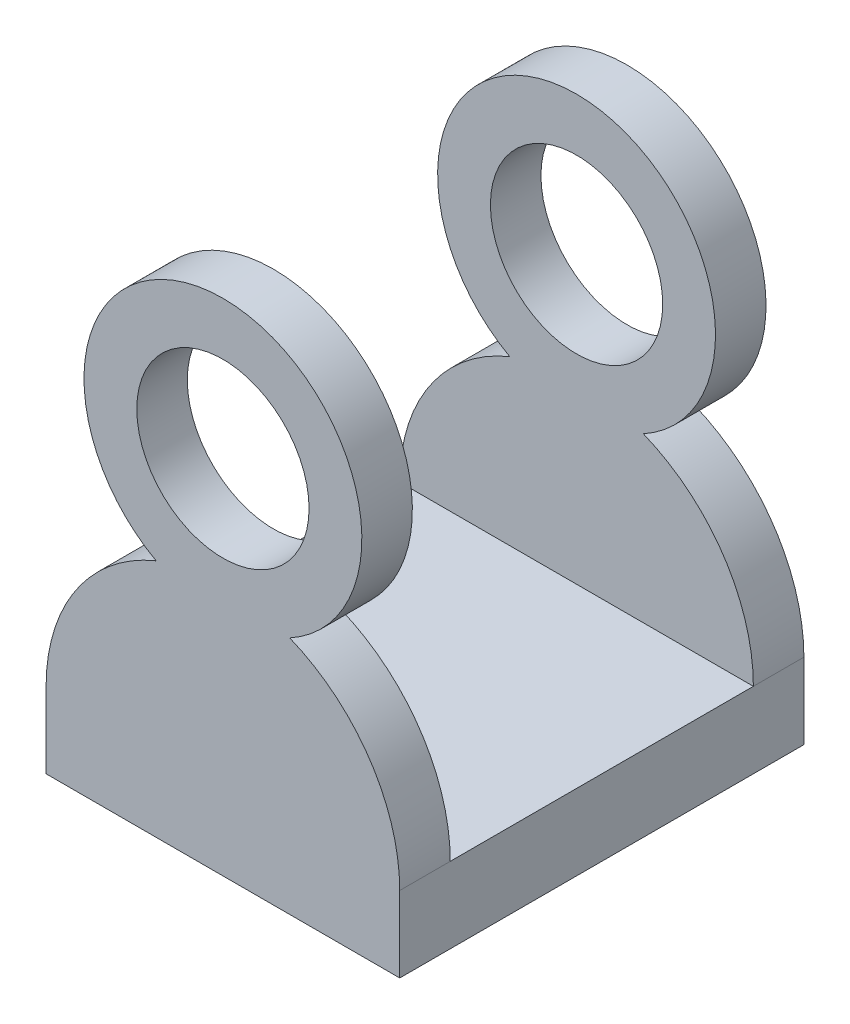
ISO-10303-21;
HEADER;
FILE_DESCRIPTION(('STEP AP214'),'2;1');
FILE_NAME('part.step','',(''),(''),'','','');
FILE_SCHEMA(('AUTOMOTIVE_DESIGN { 1 0 10303 214 1 1 1 1 }'));
ENDSEC;
DATA;
#1=APPLICATION_CONTEXT('core data for automotive mechanical design processes');
#2=APPLICATION_PROTOCOL_DEFINITION('international standard','automotive_design',2000,#1);
#3=PRODUCT_CONTEXT('',#1,'mechanical');
#4=PRODUCT('Part','Part','',(#3));
#5=PRODUCT_RELATED_PRODUCT_CATEGORY('part','',(#4));
#6=PRODUCT_DEFINITION_FORMATION('','',#4);
#7=PRODUCT_DEFINITION_CONTEXT('part definition',#1,'design');
#8=PRODUCT_DEFINITION('design','',#6,#7);
#9=PRODUCT_DEFINITION_SHAPE('','',#8);
#10=(LENGTH_UNIT() NAMED_UNIT(*) SI_UNIT(.MILLI.,.METRE.));
#11=(NAMED_UNIT(*) PLANE_ANGLE_UNIT() SI_UNIT($,.RADIAN.));
#12=(NAMED_UNIT(*) SI_UNIT($,.STERADIAN.) SOLID_ANGLE_UNIT());
#13=UNCERTAINTY_MEASURE_WITH_UNIT(LENGTH_MEASURE(1.E-05),#10,'distance_accuracy_value','');
#14=(GEOMETRIC_REPRESENTATION_CONTEXT(3) GLOBAL_UNCERTAINTY_ASSIGNED_CONTEXT((#13)) GLOBAL_UNIT_ASSIGNED_CONTEXT((#10,
#11,#12)) REPRESENTATION_CONTEXT('',''));
#15=CARTESIAN_POINT('',(0.,0.,0.));
#16=DIRECTION('',(0.,0.,1.));
#17=DIRECTION('',(1.,0.,0.));
#18=AXIS2_PLACEMENT_3D('',#15,#16,#17);
#19=CARTESIAN_POINT('',(-7.,1.5,16.));
#20=DIRECTION('',(0.,-1.,0.));
#21=DIRECTION('',(0.,0.,-1.));
#22=AXIS2_PLACEMENT_3D('',#19,#20,#21);
#23=PLANE('',#22);
#24=DIRECTION('',(1.,0.,0.));
#25=VECTOR('',#24,1.);
#26=CARTESIAN_POINT('',(-7.,1.5,2.));
#27=LINE('',#26,#25);
#28=CARTESIAN_POINT('',(-7.,1.5,2.));
#29=VERTEX_POINT('',#28);
#30=CARTESIAN_POINT('',(7.,1.5,2.));
#31=VERTEX_POINT('',#30);
#32=EDGE_CURVE('E58',#29,#31,#27,.T.);
#33=ORIENTED_EDGE('',*,*,#32,.F.);
#34=DIRECTION('',(0.,0.,-1.));
#35=VECTOR('',#34,1.);
#36=CARTESIAN_POINT('',(-7.,1.5,16.));
#37=LINE('',#36,#35);
#38=CARTESIAN_POINT('',(-7.,1.5,14.));
#39=VERTEX_POINT('',#38);
#40=EDGE_CURVE('E202',#39,#29,#37,.T.);
#41=ORIENTED_EDGE('',*,*,#40,.F.);
#42=DIRECTION('',(1.,0.,0.));
#43=VECTOR('',#42,1.);
#44=CARTESIAN_POINT('',(-7.,1.5,14.));
#45=LINE('',#44,#43);
#46=CARTESIAN_POINT('',(7.,1.5,14.));
#47=VERTEX_POINT('',#46);
#48=EDGE_CURVE('E161',#39,#47,#45,.T.);
#49=ORIENTED_EDGE('',*,*,#48,.T.);
#50=DIRECTION('',(0.,0.,-1.));
#51=VECTOR('',#50,1.);
#52=CARTESIAN_POINT('',(7.,1.5,16.));
#53=LINE('',#52,#51);
#54=EDGE_CURVE('E43',#47,#31,#53,.T.);
#55=ORIENTED_EDGE('',*,*,#54,.T.);
#56=EDGE_LOOP('',(#33,#41,#49,#55));
#57=FACE_BOUND('',#56,.T.);
#58=ADVANCED_FACE('F34',(#57),#23,.F.);
#59=CARTESIAN_POINT('',(7.,-1.5,16.));
#60=DIRECTION('',(-1.,0.,0.));
#61=DIRECTION('',(0.,0.,1.));
#62=AXIS2_PLACEMENT_3D('',#59,#60,#61);
#63=PLANE('',#62);
#64=DIRECTION('',(0.,1.,0.));
#65=VECTOR('',#64,1.);
#66=CARTESIAN_POINT('',(7.,-1.5,0.));
#67=LINE('',#66,#65);
#68=CARTESIAN_POINT('',(7.,-1.5,0.));
#69=VERTEX_POINT('',#68);
#70=CARTESIAN_POINT('',(7.,1.5,0.));
#71=VERTEX_POINT('',#70);
#72=EDGE_CURVE('E182',#69,#71,#67,.T.);
#73=ORIENTED_EDGE('',*,*,#72,.T.);
#74=DIRECTION('',(0.,0.,-1.));
#75=VECTOR('',#74,1.);
#76=CARTESIAN_POINT('',(7.,1.5,2.));
#77=LINE('',#76,#75);
#78=EDGE_CURVE('E51',#31,#71,#77,.T.);
#79=ORIENTED_EDGE('',*,*,#78,.F.);
#80=ORIENTED_EDGE('',*,*,#54,.F.);
#81=CARTESIAN_POINT('',(7.,1.5,16.));
#82=VERTEX_POINT('',#81);
#83=EDGE_CURVE('E11',#82,#47,#53,.T.);
#84=ORIENTED_EDGE('',*,*,#83,.F.);
#85=DIRECTION('',(0.,1.,0.));
#86=VECTOR('',#85,1.);
#87=CARTESIAN_POINT('',(7.,-1.5,16.));
#88=LINE('',#87,#86);
#89=CARTESIAN_POINT('',(7.,-1.5,16.));
#90=VERTEX_POINT('',#89);
#91=EDGE_CURVE('E184',#90,#82,#88,.T.);
#92=ORIENTED_EDGE('',*,*,#91,.F.);
#93=DIRECTION('',(0.,0.,-1.));
#94=VECTOR('',#93,1.);
#95=CARTESIAN_POINT('',(7.,-1.5,16.));
#96=LINE('',#95,#94);
#97=EDGE_CURVE('E192',#90,#69,#96,.T.);
#98=ORIENTED_EDGE('',*,*,#97,.T.);
#99=EDGE_LOOP('',(#73,#79,#80,#84,#92,#98));
#100=FACE_BOUND('',#99,.T.);
#101=ADVANCED_FACE('F36',(#100),#63,.F.);
#102=CARTESIAN_POINT('',(-7.,-1.5,16.));
#103=DIRECTION('',(1.,0.,0.));
#104=DIRECTION('',(0.,0.,-1.));
#105=AXIS2_PLACEMENT_3D('',#102,#103,#104);
#106=PLANE('',#105);
#107=DIRECTION('',(0.,-1.,0.));
#108=VECTOR('',#107,1.);
#109=CARTESIAN_POINT('',(-7.,-1.5,0.));
#110=LINE('',#109,#108);
#111=CARTESIAN_POINT('',(-7.,1.5,0.));
#112=VERTEX_POINT('',#111);
#113=CARTESIAN_POINT('',(-7.,-1.5,0.));
#114=VERTEX_POINT('',#113);
#115=EDGE_CURVE('E194',#112,#114,#110,.T.);
#116=ORIENTED_EDGE('',*,*,#115,.T.);
#117=DIRECTION('',(0.,0.,-1.));
#118=VECTOR('',#117,1.);
#119=CARTESIAN_POINT('',(-7.,-1.5,16.));
#120=LINE('',#119,#118);
#121=CARTESIAN_POINT('',(-7.,-1.5,16.));
#122=VERTEX_POINT('',#121);
#123=EDGE_CURVE('E199',#122,#114,#120,.T.);
#124=ORIENTED_EDGE('',*,*,#123,.F.);
#125=DIRECTION('',(0.,-1.,0.));
#126=VECTOR('',#125,1.);
#127=CARTESIAN_POINT('',(-7.,-1.5,16.));
#128=LINE('',#127,#126);
#129=CARTESIAN_POINT('',(-7.,1.5,16.));
#130=VERTEX_POINT('',#129);
#131=EDGE_CURVE('E187',#130,#122,#128,.T.);
#132=ORIENTED_EDGE('',*,*,#131,.F.);
#133=EDGE_CURVE('E203',#130,#39,#37,.T.);
#134=ORIENTED_EDGE('',*,*,#133,.T.);
#135=ORIENTED_EDGE('',*,*,#40,.T.);
#136=DIRECTION('',(0.,0.,-1.));
#137=VECTOR('',#136,1.);
#138=CARTESIAN_POINT('',(-7.,1.5,2.));
#139=LINE('',#138,#137);
#140=EDGE_CURVE('E139',#29,#112,#139,.T.);
#141=ORIENTED_EDGE('',*,*,#140,.T.);
#142=EDGE_LOOP('',(#116,#124,#132,#134,#135,#141));
#143=FACE_BOUND('',#142,.T.);
#144=ADVANCED_FACE('F227',(#143),#106,.F.);
#145=CARTESIAN_POINT('',(-7.,-1.5,16.));
#146=DIRECTION('',(0.,1.,0.));
#147=DIRECTION('',(0.,0.,1.));
#148=AXIS2_PLACEMENT_3D('',#145,#146,#147);
#149=PLANE('',#148);
#150=DIRECTION('',(1.,0.,0.));
#151=VECTOR('',#150,1.);
#152=CARTESIAN_POINT('',(-7.,-1.5,0.));
#153=LINE('',#152,#151);
#154=EDGE_CURVE('E188',#114,#69,#153,.T.);
#155=ORIENTED_EDGE('',*,*,#154,.T.);
#156=ORIENTED_EDGE('',*,*,#97,.F.);
#157=DIRECTION('',(1.,0.,0.));
#158=VECTOR('',#157,1.);
#159=CARTESIAN_POINT('',(-7.,-1.5,16.));
#160=LINE('',#159,#158);
#161=EDGE_CURVE('E190',#122,#90,#160,.T.);
#162=ORIENTED_EDGE('',*,*,#161,.F.);
#163=ORIENTED_EDGE('',*,*,#123,.T.);
#164=EDGE_LOOP('',(#155,#156,#162,#163));
#165=FACE_BOUND('',#164,.T.);
#166=ADVANCED_FACE('F231',(#165),#149,.F.);
#167=CARTESIAN_POINT('',(0.,0.,16.));
#168=DIRECTION('',(0.,0.,-1.));
#169=DIRECTION('',(-1.,0.,0.));
#170=AXIS2_PLACEMENT_3D('',#167,#168,#169);
#171=PLANE('',#170);
#172=CARTESIAN_POINT('',(0.,12.8043024604094,16.));
#173=DIRECTION('',(0.,0.,1.));
#174=DIRECTION('',(1.,0.,0.));
#175=AXIS2_PLACEMENT_3D('',#172,#173,#174);
#176=CIRCLE('',#175,3.41);
#177=CARTESIAN_POINT('',(3.41,12.8043024604094,16.));
#178=VERTEX_POINT('',#177);
#179=EDGE_CURVE('E152',#178,#178,#176,.T.);
#180=ORIENTED_EDGE('',*,*,#179,.F.);
#181=EDGE_LOOP('',(#180));
#182=FACE_BOUND('',#181,.T.);
#183=ORIENTED_EDGE('',*,*,#91,.T.);
#184=CARTESIAN_POINT('',(0.,1.5,16.));
#185=DIRECTION('',(0.,0.,1.));
#186=DIRECTION('',(1.,0.,0.));
#187=AXIS2_PLACEMENT_3D('',#184,#185,#186);
#188=CIRCLE('',#187,7.);
#189=CARTESIAN_POINT('',(2.64393604408514,7.98148148148148,16.));
#190=VERTEX_POINT('',#189);
#191=EDGE_CURVE('E175',#82,#190,#188,.T.);
#192=ORIENTED_EDGE('',*,*,#191,.T.);
#193=CARTESIAN_POINT('',(0.,12.8043024604094,16.));
#194=DIRECTION('',(0.,0.,1.));
#195=DIRECTION('',(1.,0.,0.));
#196=AXIS2_PLACEMENT_3D('',#193,#194,#195);
#197=CIRCLE('',#196,5.5);
#198=CARTESIAN_POINT('',(-2.64393604408515,7.98148148148149,16.));
#199=VERTEX_POINT('',#198);
#200=EDGE_CURVE('E162',#190,#199,#197,.T.);
#201=ORIENTED_EDGE('',*,*,#200,.T.);
#202=CARTESIAN_POINT('',(0.,1.5,16.));
#203=DIRECTION('',(0.,0.,1.));
#204=DIRECTION('',(1.,0.,0.));
#205=AXIS2_PLACEMENT_3D('',#202,#203,#204);
#206=CIRCLE('',#205,7.);
#207=EDGE_CURVE('E172',#199,#130,#206,.T.);
#208=ORIENTED_EDGE('',*,*,#207,.T.);
#209=ORIENTED_EDGE('',*,*,#131,.T.);
#210=ORIENTED_EDGE('',*,*,#161,.T.);
#211=EDGE_LOOP('',(#183,#192,#201,#208,#209,#210));
#212=FACE_BOUND('',#211,.T.);
#213=ADVANCED_FACE('F235',(#182,#212),#171,.F.);
#214=CARTESIAN_POINT('',(0.,0.,0.));
#215=DIRECTION('',(0.,0.,-1.));
#216=DIRECTION('',(-1.,0.,0.));
#217=AXIS2_PLACEMENT_3D('',#214,#215,#216);
#218=PLANE('',#217);
#219=CARTESIAN_POINT('',(0.,12.8043024604094,0.));
#220=DIRECTION('',(0.,0.,1.));
#221=DIRECTION('',(1.,0.,0.));
#222=AXIS2_PLACEMENT_3D('',#219,#220,#221);
#223=CIRCLE('',#222,3.41);
#224=CARTESIAN_POINT('',(3.41,12.8043024604094,0.));
#225=VERTEX_POINT('',#224);
#226=EDGE_CURVE('E144',#225,#225,#223,.T.);
#227=ORIENTED_EDGE('',*,*,#226,.T.);
#228=EDGE_LOOP('',(#227));
#229=FACE_BOUND('',#228,.T.);
#230=ORIENTED_EDGE('',*,*,#72,.F.);
#231=ORIENTED_EDGE('',*,*,#154,.F.);
#232=ORIENTED_EDGE('',*,*,#115,.F.);
#233=CARTESIAN_POINT('',(0.,1.5,0.));
#234=DIRECTION('',(0.,0.,1.));
#235=DIRECTION('',(1.,0.,0.));
#236=AXIS2_PLACEMENT_3D('',#233,#234,#235);
#237=CIRCLE('',#236,7.);
#238=CARTESIAN_POINT('',(-2.64393604408515,7.98148148148149,0.));
#239=VERTEX_POINT('',#238);
#240=EDGE_CURVE('E148',#239,#112,#237,.T.);
#241=ORIENTED_EDGE('',*,*,#240,.F.);
#242=CARTESIAN_POINT('',(0.,12.8043024604094,0.));
#243=DIRECTION('',(0.,0.,1.));
#244=DIRECTION('',(1.,0.,0.));
#245=AXIS2_PLACEMENT_3D('',#242,#243,#244);
#246=CIRCLE('',#245,5.5);
#247=CARTESIAN_POINT('',(2.64393604408514,7.98148148148148,0.));
#248=VERTEX_POINT('',#247);
#249=EDGE_CURVE('E131',#248,#239,#246,.T.);
#250=ORIENTED_EDGE('',*,*,#249,.F.);
#251=CARTESIAN_POINT('',(0.,1.5,0.));
#252=DIRECTION('',(0.,0.,1.));
#253=DIRECTION('',(1.,0.,0.));
#254=AXIS2_PLACEMENT_3D('',#251,#252,#253);
#255=CIRCLE('',#254,7.);
#256=EDGE_CURVE('E140',#71,#248,#255,.T.);
#257=ORIENTED_EDGE('',*,*,#256,.F.);
#258=EDGE_LOOP('',(#230,#231,#232,#241,#250,#257));
#259=FACE_BOUND('',#258,.T.);
#260=ADVANCED_FACE('F237',(#229,#259),#218,.T.);
#261=CARTESIAN_POINT('',(0.,1.5,14.));
#262=DIRECTION('',(0.,0.,1.));
#263=DIRECTION('',(1.,0.,0.));
#264=AXIS2_PLACEMENT_3D('',#261,#262,#263);
#265=CYLINDRICAL_SURFACE('',#264,7.);
#266=ORIENTED_EDGE('',*,*,#207,.F.);
#267=DIRECTION('',(0.,0.,1.));
#268=VECTOR('',#267,1.);
#269=CARTESIAN_POINT('',(-2.64393604408515,7.98148148148149,14.));
#270=LINE('',#269,#268);
#271=CARTESIAN_POINT('',(-2.64393604408515,7.98148148148149,14.));
#272=VERTEX_POINT('',#271);
#273=EDGE_CURVE('E180',#272,#199,#270,.T.);
#274=ORIENTED_EDGE('',*,*,#273,.F.);
#275=CARTESIAN_POINT('',(0.,1.5,14.));
#276=DIRECTION('',(0.,0.,1.));
#277=DIRECTION('',(1.,0.,0.));
#278=AXIS2_PLACEMENT_3D('',#275,#276,#277);
#279=CIRCLE('',#278,7.);
#280=EDGE_CURVE('E158',#272,#39,#279,.T.);
#281=ORIENTED_EDGE('',*,*,#280,.T.);
#282=ORIENTED_EDGE('',*,*,#133,.F.);
#283=EDGE_LOOP('',(#266,#274,#281,#282));
#284=FACE_BOUND('',#283,.T.);
#285=ADVANCED_FACE('F240',(#284),#265,.T.);
#286=CARTESIAN_POINT('',(0.,12.8043024604094,14.));
#287=DIRECTION('',(0.,0.,1.));
#288=DIRECTION('',(1.,0.,0.));
#289=AXIS2_PLACEMENT_3D('',#286,#287,#288);
#290=CYLINDRICAL_SURFACE('',#289,5.5);
#291=ORIENTED_EDGE('',*,*,#200,.F.);
#292=DIRECTION('',(0.,0.,1.));
#293=VECTOR('',#292,1.);
#294=CARTESIAN_POINT('',(2.64393604408514,7.98148148148148,14.));
#295=LINE('',#294,#293);
#296=CARTESIAN_POINT('',(2.64393604408514,7.98148148148148,14.));
#297=VERTEX_POINT('',#296);
#298=EDGE_CURVE('E171',#297,#190,#295,.T.);
#299=ORIENTED_EDGE('',*,*,#298,.F.);
#300=CARTESIAN_POINT('',(0.,12.8043024604094,14.));
#301=DIRECTION('',(0.,0.,1.));
#302=DIRECTION('',(1.,0.,0.));
#303=AXIS2_PLACEMENT_3D('',#300,#301,#302);
#304=CIRCLE('',#303,5.5);
#305=EDGE_CURVE('E168',#297,#272,#304,.T.);
#306=ORIENTED_EDGE('',*,*,#305,.T.);
#307=ORIENTED_EDGE('',*,*,#273,.T.);
#308=EDGE_LOOP('',(#291,#299,#306,#307));
#309=FACE_BOUND('',#308,.T.);
#310=ADVANCED_FACE('F247',(#309),#290,.T.);
#311=CARTESIAN_POINT('',(0.,1.5,14.));
#312=DIRECTION('',(0.,0.,1.));
#313=DIRECTION('',(1.,0.,0.));
#314=AXIS2_PLACEMENT_3D('',#311,#312,#313);
#315=CYLINDRICAL_SURFACE('',#314,7.);
#316=ORIENTED_EDGE('',*,*,#191,.F.);
#317=ORIENTED_EDGE('',*,*,#83,.T.);
#318=CARTESIAN_POINT('',(0.,1.5,14.));
#319=DIRECTION('',(0.,0.,1.));
#320=DIRECTION('',(1.,0.,0.));
#321=AXIS2_PLACEMENT_3D('',#318,#319,#320);
#322=CIRCLE('',#321,7.);
#323=EDGE_CURVE('E165',#47,#297,#322,.T.);
#324=ORIENTED_EDGE('',*,*,#323,.T.);
#325=ORIENTED_EDGE('',*,*,#298,.T.);
#326=EDGE_LOOP('',(#316,#317,#324,#325));
#327=FACE_BOUND('',#326,.T.);
#328=ADVANCED_FACE('F221',(#327),#315,.T.);
#329=CARTESIAN_POINT('',(0.,1.5,14.));
#330=DIRECTION('',(0.,0.,1.));
#331=DIRECTION('',(1.,0.,0.));
#332=AXIS2_PLACEMENT_3D('',#329,#330,#331);
#333=PLANE('',#332);
#334=CARTESIAN_POINT('',(0.,12.8043024604094,14.));
#335=DIRECTION('',(0.,0.,1.));
#336=DIRECTION('',(1.,0.,0.));
#337=AXIS2_PLACEMENT_3D('',#334,#335,#336);
#338=CIRCLE('',#337,3.41);
#339=CARTESIAN_POINT('',(3.41,12.8043024604094,14.));
#340=VERTEX_POINT('',#339);
#341=EDGE_CURVE('E157',#340,#340,#338,.T.);
#342=ORIENTED_EDGE('',*,*,#341,.T.);
#343=EDGE_LOOP('',(#342));
#344=FACE_BOUND('',#343,.T.);
#345=ORIENTED_EDGE('',*,*,#280,.F.);
#346=ORIENTED_EDGE('',*,*,#305,.F.);
#347=ORIENTED_EDGE('',*,*,#323,.F.);
#348=ORIENTED_EDGE('',*,*,#48,.F.);
#349=EDGE_LOOP('',(#345,#346,#347,#348));
#350=FACE_BOUND('',#349,.T.);
#351=ADVANCED_FACE('F208',(#344,#350),#333,.F.);
#352=CARTESIAN_POINT('',(0.,12.8043024604094,8.2));
#353=DIRECTION('',(0.,0.,1.));
#354=DIRECTION('',(1.,0.,0.));
#355=AXIS2_PLACEMENT_3D('',#352,#353,#354);
#356=CYLINDRICAL_SURFACE('',#355,3.41);
#357=ORIENTED_EDGE('',*,*,#179,.T.);
#358=EDGE_LOOP('',(#357));
#359=FACE_BOUND('',#358,.T.);
#360=ORIENTED_EDGE('',*,*,#341,.F.);
#361=EDGE_LOOP('',(#360));
#362=FACE_BOUND('',#361,.T.);
#363=ADVANCED_FACE('F211',(#359,#362),#356,.F.);
#364=CARTESIAN_POINT('',(0.,1.5,2.));
#365=DIRECTION('',(0.,0.,-1.));
#366=DIRECTION('',(-1.,0.,0.));
#367=AXIS2_PLACEMENT_3D('',#364,#365,#366);
#368=CYLINDRICAL_SURFACE('',#367,7.);
#369=ORIENTED_EDGE('',*,*,#240,.T.);
#370=ORIENTED_EDGE('',*,*,#140,.F.);
#371=CARTESIAN_POINT('',(0.,1.5,2.));
#372=DIRECTION('',(0.,0.,1.));
#373=DIRECTION('',(1.,0.,0.));
#374=AXIS2_PLACEMENT_3D('',#371,#372,#373);
#375=CIRCLE('',#374,7.);
#376=CARTESIAN_POINT('',(-2.64393604408515,7.98148148148149,2.));
#377=VERTEX_POINT('',#376);
#378=EDGE_CURVE('E119',#377,#29,#375,.T.);
#379=ORIENTED_EDGE('',*,*,#378,.F.);
#380=DIRECTION('',(0.,0.,-1.));
#381=VECTOR('',#380,1.);
#382=CARTESIAN_POINT('',(-2.64393604408515,7.98148148148149,2.));
#383=LINE('',#382,#381);
#384=EDGE_CURVE('E128',#377,#239,#383,.T.);
#385=ORIENTED_EDGE('',*,*,#384,.T.);
#386=EDGE_LOOP('',(#369,#370,#379,#385));
#387=FACE_BOUND('',#386,.T.);
#388=ADVANCED_FACE('F137',(#387),#368,.T.);
#389=CARTESIAN_POINT('',(0.,1.5,2.));
#390=DIRECTION('',(0.,0.,-1.));
#391=DIRECTION('',(-1.,0.,0.));
#392=AXIS2_PLACEMENT_3D('',#389,#390,#391);
#393=CYLINDRICAL_SURFACE('',#392,7.);
#394=ORIENTED_EDGE('',*,*,#256,.T.);
#395=DIRECTION('',(0.,0.,-1.));
#396=VECTOR('',#395,1.);
#397=CARTESIAN_POINT('',(2.64393604408514,7.98148148148148,2.));
#398=LINE('',#397,#396);
#399=CARTESIAN_POINT('',(2.64393604408514,7.98148148148148,2.));
#400=VERTEX_POINT('',#399);
#401=EDGE_CURVE('E135',#400,#248,#398,.T.);
#402=ORIENTED_EDGE('',*,*,#401,.F.);
#403=CARTESIAN_POINT('',(0.,1.5,2.));
#404=DIRECTION('',(0.,0.,1.));
#405=DIRECTION('',(1.,0.,0.));
#406=AXIS2_PLACEMENT_3D('',#403,#404,#405);
#407=CIRCLE('',#406,7.);
#408=EDGE_CURVE('E122',#31,#400,#407,.T.);
#409=ORIENTED_EDGE('',*,*,#408,.F.);
#410=ORIENTED_EDGE('',*,*,#78,.T.);
#411=EDGE_LOOP('',(#394,#402,#409,#410));
#412=FACE_BOUND('',#411,.T.);
#413=ADVANCED_FACE('F219',(#412),#393,.T.);
#414=CARTESIAN_POINT('',(0.,12.8043024604094,2.));
#415=DIRECTION('',(0.,0.,-1.));
#416=DIRECTION('',(-1.,0.,0.));
#417=AXIS2_PLACEMENT_3D('',#414,#415,#416);
#418=CYLINDRICAL_SURFACE('',#417,5.5);
#419=ORIENTED_EDGE('',*,*,#249,.T.);
#420=ORIENTED_EDGE('',*,*,#384,.F.);
#421=CARTESIAN_POINT('',(0.,12.8043024604094,2.));
#422=DIRECTION('',(0.,0.,1.));
#423=DIRECTION('',(1.,0.,0.));
#424=AXIS2_PLACEMENT_3D('',#421,#422,#423);
#425=CIRCLE('',#424,5.5);
#426=EDGE_CURVE('E115',#400,#377,#425,.T.);
#427=ORIENTED_EDGE('',*,*,#426,.F.);
#428=ORIENTED_EDGE('',*,*,#401,.T.);
#429=EDGE_LOOP('',(#419,#420,#427,#428));
#430=FACE_BOUND('',#429,.T.);
#431=ADVANCED_FACE('F129',(#430),#418,.T.);
#432=CARTESIAN_POINT('',(0.,1.5,2.));
#433=DIRECTION('',(0.,0.,-1.));
#434=DIRECTION('',(1.,0.,0.));
#435=AXIS2_PLACEMENT_3D('',#432,#433,#434);
#436=PLANE('',#435);
#437=CARTESIAN_POINT('',(0.,12.8043024604094,2.));
#438=DIRECTION('',(0.,0.,-1.));
#439=DIRECTION('',(-1.,0.,0.));
#440=AXIS2_PLACEMENT_3D('',#437,#438,#439);
#441=CIRCLE('',#440,3.41);
#442=CARTESIAN_POINT('',(-3.41,12.8043024604094,2.));
#443=VERTEX_POINT('',#442);
#444=EDGE_CURVE('E38',#443,#443,#441,.F.);
#445=ORIENTED_EDGE('',*,*,#444,.F.);
#446=EDGE_LOOP('',(#445));
#447=FACE_BOUND('',#446,.T.);
#448=ORIENTED_EDGE('',*,*,#378,.T.);
#449=ORIENTED_EDGE('',*,*,#32,.T.);
#450=ORIENTED_EDGE('',*,*,#408,.T.);
#451=ORIENTED_EDGE('',*,*,#426,.T.);
#452=EDGE_LOOP('',(#448,#449,#450,#451));
#453=FACE_BOUND('',#452,.T.);
#454=ADVANCED_FACE('F117',(#447,#453),#436,.F.);
#455=CARTESIAN_POINT('',(0.,12.8043024604094,7.8));
#456=DIRECTION('',(0.,0.,-1.));
#457=DIRECTION('',(-1.,0.,0.));
#458=AXIS2_PLACEMENT_3D('',#455,#456,#457);
#459=CYLINDRICAL_SURFACE('',#458,3.41);
#460=ORIENTED_EDGE('',*,*,#226,.F.);
#461=EDGE_LOOP('',(#460));
#462=FACE_BOUND('',#461,.T.);
#463=ORIENTED_EDGE('',*,*,#444,.T.);
#464=EDGE_LOOP('',(#463));
#465=FACE_BOUND('',#464,.T.);
#466=ADVANCED_FACE('F281',(#462,#465),#459,.F.);
#467=CLOSED_SHELL('',(#58,#101,#144,#166,#213,#260,#285,#310,#328,#351,#363,#388,#413,#431,#454,#466));
#468=MANIFOLD_SOLID_BREP('B2',#467);
#469=ADVANCED_BREP_SHAPE_REPRESENTATION('',(#18,#468),#14);
#470=SHAPE_DEFINITION_REPRESENTATION(#9,#469);
ENDSEC;
END-ISO-10303-21;
